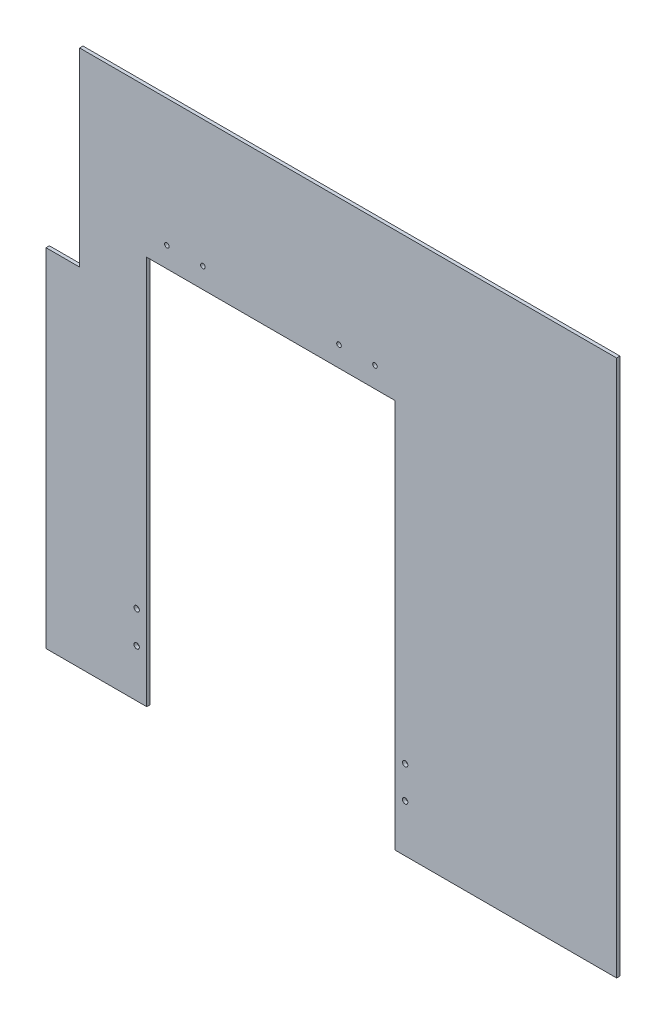
ISO-10303-21;
HEADER;
FILE_DESCRIPTION(('STEP AP214'),'2;1');
FILE_NAME('part.step','',(''),(''),'','','');
FILE_SCHEMA(('AUTOMOTIVE_DESIGN { 1 0 10303 214 1 1 1 1 }'));
ENDSEC;
DATA;
#1=APPLICATION_CONTEXT('core data for automotive mechanical design processes');
#2=APPLICATION_PROTOCOL_DEFINITION('international standard','automotive_design',2000,#1);
#3=PRODUCT_CONTEXT('',#1,'mechanical');
#4=PRODUCT('Part','Part','',(#3));
#5=PRODUCT_RELATED_PRODUCT_CATEGORY('part','',(#4));
#6=PRODUCT_DEFINITION_FORMATION('','',#4);
#7=PRODUCT_DEFINITION_CONTEXT('part definition',#1,'design');
#8=PRODUCT_DEFINITION('design','',#6,#7);
#9=PRODUCT_DEFINITION_SHAPE('','',#8);
#10=(LENGTH_UNIT() NAMED_UNIT(*) SI_UNIT(.MILLI.,.METRE.));
#11=(NAMED_UNIT(*) PLANE_ANGLE_UNIT() SI_UNIT($,.RADIAN.));
#12=(NAMED_UNIT(*) SI_UNIT($,.STERADIAN.) SOLID_ANGLE_UNIT());
#13=UNCERTAINTY_MEASURE_WITH_UNIT(LENGTH_MEASURE(1.E-05),#10,'distance_accuracy_value','');
#14=(GEOMETRIC_REPRESENTATION_CONTEXT(3) GLOBAL_UNCERTAINTY_ASSIGNED_CONTEXT((#13)) GLOBAL_UNIT_ASSIGNED_CONTEXT((#10,
#11,#12)) REPRESENTATION_CONTEXT('',''));
#15=CARTESIAN_POINT('',(0.,0.,0.));
#16=DIRECTION('',(0.,0.,1.));
#17=DIRECTION('',(1.,0.,0.));
#18=AXIS2_PLACEMENT_3D('',#15,#16,#17);
#19=CARTESIAN_POINT('',(0.,0.,3.175));
#20=DIRECTION('',(0.,1.,0.));
#21=DIRECTION('',(0.,0.,1.));
#22=AXIS2_PLACEMENT_3D('',#19,#20,#21);
#23=PLANE('',#22);
#24=DIRECTION('',(1.,0.,0.));
#25=VECTOR('',#24,1.);
#26=CARTESIAN_POINT('',(0.,0.,0.));
#27=LINE('',#26,#25);
#28=CARTESIAN_POINT('',(0.,0.,0.));
#29=VERTEX_POINT('',#28);
#30=CARTESIAN_POINT('',(95.2500000000001,-1.02649894704531E-13,0.));
#31=VERTEX_POINT('',#30);
#32=EDGE_CURVE('E144',#29,#31,#27,.T.);
#33=ORIENTED_EDGE('',*,*,#32,.T.);
#34=DIRECTION('',(0.,0.,-1.));
#35=VECTOR('',#34,1.);
#36=CARTESIAN_POINT('',(95.2500000000001,-1.02649894704531E-13,44.45));
#37=LINE('',#36,#35);
#38=CARTESIAN_POINT('',(95.2500000000001,-1.02649894704531E-13,3.175));
#39=VERTEX_POINT('',#38);
#40=EDGE_CURVE('E241',#39,#31,#37,.T.);
#41=ORIENTED_EDGE('',*,*,#40,.F.);
#42=DIRECTION('',(1.,0.,0.));
#43=VECTOR('',#42,1.);
#44=CARTESIAN_POINT('',(0.,0.,3.175));
#45=LINE('',#44,#43);
#46=CARTESIAN_POINT('',(0.,0.,3.175));
#47=VERTEX_POINT('',#46);
#48=EDGE_CURVE('E194',#47,#39,#45,.T.);
#49=ORIENTED_EDGE('',*,*,#48,.F.);
#50=DIRECTION('',(0.,0.,-1.));
#51=VECTOR('',#50,1.);
#52=CARTESIAN_POINT('',(0.,0.,3.175));
#53=LINE('',#52,#51);
#54=EDGE_CURVE('E11',#47,#29,#53,.T.);
#55=ORIENTED_EDGE('',*,*,#54,.T.);
#56=EDGE_LOOP('',(#33,#41,#49,#55));
#57=FACE_BOUND('',#56,.T.);
#58=ADVANCED_FACE('F43',(#57),#23,.F.);
#59=CARTESIAN_POINT('',(0.,0.,3.175));
#60=DIRECTION('',(1.,0.,0.));
#61=DIRECTION('',(0.,0.,-1.));
#62=AXIS2_PLACEMENT_3D('',#59,#60,#61);
#63=PLANE('',#62);
#64=DIRECTION('',(0.,-1.,0.));
#65=VECTOR('',#64,1.);
#66=CARTESIAN_POINT('',(0.,0.,3.175));
#67=LINE('',#66,#65);
#68=CARTESIAN_POINT('',(0.,328.45375,3.175));
#69=VERTEX_POINT('',#68);
#70=EDGE_CURVE('E138',#69,#47,#67,.T.);
#71=ORIENTED_EDGE('',*,*,#70,.F.);
#72=DIRECTION('',(0.,0.,1.));
#73=VECTOR('',#72,1.);
#74=CARTESIAN_POINT('',(0.,328.45375,0.));
#75=LINE('',#74,#73);
#76=CARTESIAN_POINT('',(0.,328.45375,0.));
#77=VERTEX_POINT('',#76);
#78=EDGE_CURVE('E125',#77,#69,#75,.T.);
#79=ORIENTED_EDGE('',*,*,#78,.F.);
#80=DIRECTION('',(0.,-1.,0.));
#81=VECTOR('',#80,1.);
#82=CARTESIAN_POINT('',(0.,0.,0.));
#83=LINE('',#82,#81);
#84=EDGE_CURVE('E136',#77,#29,#83,.T.);
#85=ORIENTED_EDGE('',*,*,#84,.T.);
#86=ORIENTED_EDGE('',*,*,#54,.F.);
#87=EDGE_LOOP('',(#71,#79,#85,#86));
#88=FACE_BOUND('',#87,.T.);
#89=ADVANCED_FACE('F45',(#88),#63,.F.);
#90=CARTESIAN_POINT('',(330.2,0.,3.175));
#91=VERTEX_POINT('',#90);
#92=CARTESIAN_POINT('',(539.75,0.,3.175));
#93=VERTEX_POINT('',#92);
#94=EDGE_CURVE('E197',#91,#93,#45,.T.);
#95=ORIENTED_EDGE('',*,*,#94,.F.);
#96=DIRECTION('',(0.,0.,-1.));
#97=VECTOR('',#96,1.);
#98=CARTESIAN_POINT('',(330.2,0.,44.45));
#99=LINE('',#98,#97);
#100=CARTESIAN_POINT('',(330.2,0.,0.));
#101=VERTEX_POINT('',#100);
#102=EDGE_CURVE('E237',#91,#101,#99,.T.);
#103=ORIENTED_EDGE('',*,*,#102,.T.);
#104=CARTESIAN_POINT('',(539.75,0.,0.));
#105=VERTEX_POINT('',#104);
#106=EDGE_CURVE('E146',#101,#105,#27,.T.);
#107=ORIENTED_EDGE('',*,*,#106,.T.);
#108=DIRECTION('',(0.,0.,-1.));
#109=VECTOR('',#108,1.);
#110=CARTESIAN_POINT('',(539.75,0.,3.175));
#111=LINE('',#110,#109);
#112=EDGE_CURVE('E52',#93,#105,#111,.T.);
#113=ORIENTED_EDGE('',*,*,#112,.F.);
#114=EDGE_LOOP('',(#95,#103,#107,#113));
#115=FACE_BOUND('',#114,.T.);
#116=ADVANCED_FACE('F321',(#115),#23,.F.);
#117=CARTESIAN_POINT('',(539.75,0.,3.175));
#118=DIRECTION('',(-1.,0.,0.));
#119=DIRECTION('',(0.,0.,1.));
#120=AXIS2_PLACEMENT_3D('',#117,#118,#119);
#121=PLANE('',#120);
#122=DIRECTION('',(0.,1.,0.));
#123=VECTOR('',#122,1.);
#124=CARTESIAN_POINT('',(539.75,0.,0.));
#125=LINE('',#124,#123);
#126=CARTESIAN_POINT('',(539.75,508.,0.));
#127=VERTEX_POINT('',#126);
#128=EDGE_CURVE('E160',#105,#127,#125,.T.);
#129=ORIENTED_EDGE('',*,*,#128,.T.);
#130=DIRECTION('',(0.,0.,-1.));
#131=VECTOR('',#130,1.);
#132=CARTESIAN_POINT('',(539.75,508.,3.175));
#133=LINE('',#132,#131);
#134=CARTESIAN_POINT('',(539.75,508.,3.175));
#135=VERTEX_POINT('',#134);
#136=EDGE_CURVE('E167',#135,#127,#133,.T.);
#137=ORIENTED_EDGE('',*,*,#136,.F.);
#138=DIRECTION('',(0.,1.,0.));
#139=VECTOR('',#138,1.);
#140=CARTESIAN_POINT('',(539.75,0.,3.175));
#141=LINE('',#140,#139);
#142=EDGE_CURVE('E178',#93,#135,#141,.T.);
#143=ORIENTED_EDGE('',*,*,#142,.F.);
#144=ORIENTED_EDGE('',*,*,#112,.T.);
#145=EDGE_LOOP('',(#129,#137,#143,#144));
#146=FACE_BOUND('',#145,.T.);
#147=ADVANCED_FACE('F176',(#146),#121,.F.);
#148=CARTESIAN_POINT('',(0.,508.,3.175));
#149=DIRECTION('',(0.,-1.,0.));
#150=DIRECTION('',(0.,0.,-1.));
#151=AXIS2_PLACEMENT_3D('',#148,#149,#150);
#152=PLANE('',#151);
#153=DIRECTION('',(-1.,0.,0.));
#154=VECTOR('',#153,1.);
#155=CARTESIAN_POINT('',(0.,508.,0.));
#156=LINE('',#155,#154);
#157=CARTESIAN_POINT('',(31.75,508.,0.));
#158=VERTEX_POINT('',#157);
#159=EDGE_CURVE('E163',#127,#158,#156,.T.);
#160=ORIENTED_EDGE('',*,*,#159,.T.);
#161=DIRECTION('',(0.,0.,1.));
#162=VECTOR('',#161,1.);
#163=CARTESIAN_POINT('',(31.75,508.,0.));
#164=LINE('',#163,#162);
#165=CARTESIAN_POINT('',(31.75,508.,3.175));
#166=VERTEX_POINT('',#165);
#167=EDGE_CURVE('E188',#158,#166,#164,.T.);
#168=ORIENTED_EDGE('',*,*,#167,.T.);
#169=DIRECTION('',(-1.,0.,0.));
#170=VECTOR('',#169,1.);
#171=CARTESIAN_POINT('',(0.,508.,3.175));
#172=LINE('',#171,#170);
#173=EDGE_CURVE('E156',#135,#166,#172,.T.);
#174=ORIENTED_EDGE('',*,*,#173,.F.);
#175=ORIENTED_EDGE('',*,*,#136,.T.);
#176=EDGE_LOOP('',(#160,#168,#174,#175));
#177=FACE_BOUND('',#176,.T.);
#178=ADVANCED_FACE('F186',(#177),#152,.F.);
#179=CARTESIAN_POINT('',(0.,0.,3.175));
#180=DIRECTION('',(0.,0.,-1.));
#181=DIRECTION('',(-1.,0.,0.));
#182=AXIS2_PLACEMENT_3D('',#179,#180,#181);
#183=PLANE('',#182);
#184=CARTESIAN_POINT('',(311.1754,387.604,3.175));
#185=DIRECTION('',(0.,0.,-1.));
#186=DIRECTION('',(-1.,0.,0.));
#187=AXIS2_PLACEMENT_3D('',#184,#185,#186);
#188=CIRCLE('',#187,2.15900000000003);
#189=CARTESIAN_POINT('',(309.0164,387.604,3.175));
#190=VERTEX_POINT('',#189);
#191=EDGE_CURVE('E263',#190,#190,#188,.T.);
#192=ORIENTED_EDGE('',*,*,#191,.T.);
#193=EDGE_LOOP('',(#192));
#194=FACE_BOUND('',#193,.T.);
#195=CARTESIAN_POINT('',(277.1394,387.604,3.175));
#196=DIRECTION('',(0.,0.,-1.));
#197=DIRECTION('',(-1.,0.,0.));
#198=AXIS2_PLACEMENT_3D('',#195,#196,#197);
#199=CIRCLE('',#198,2.15900000000003);
#200=CARTESIAN_POINT('',(274.9804,387.604,3.175));
#201=VERTEX_POINT('',#200);
#202=EDGE_CURVE('E280',#201,#201,#199,.T.);
#203=ORIENTED_EDGE('',*,*,#202,.T.);
#204=EDGE_LOOP('',(#203));
#205=FACE_BOUND('',#204,.T.);
#206=CARTESIAN_POINT('',(148.3614,387.604,3.175));
#207=DIRECTION('',(0.,0.,-1.));
#208=DIRECTION('',(-1.,0.,0.));
#209=AXIS2_PLACEMENT_3D('',#206,#207,#208);
#210=CIRCLE('',#209,2.159);
#211=CARTESIAN_POINT('',(146.2024,387.604,3.175));
#212=VERTEX_POINT('',#211);
#213=EDGE_CURVE('E272',#212,#212,#210,.T.);
#214=ORIENTED_EDGE('',*,*,#213,.T.);
#215=EDGE_LOOP('',(#214));
#216=FACE_BOUND('',#215,.T.);
#217=CARTESIAN_POINT('',(114.3254,387.604,3.175));
#218=DIRECTION('',(0.,0.,-1.));
#219=DIRECTION('',(-1.,0.,0.));
#220=AXIS2_PLACEMENT_3D('',#217,#218,#219);
#221=CIRCLE('',#220,2.159);
#222=CARTESIAN_POINT('',(112.1664,387.604,3.175));
#223=VERTEX_POINT('',#222);
#224=EDGE_CURVE('E264',#223,#223,#221,.T.);
#225=ORIENTED_EDGE('',*,*,#224,.T.);
#226=EDGE_LOOP('',(#225));
#227=FACE_BOUND('',#226,.T.);
#228=CARTESIAN_POINT('',(85.7250000000001,45.085,3.175));
#229=DIRECTION('',(0.,0.,-1.));
#230=DIRECTION('',(-1.,0.,0.));
#231=AXIS2_PLACEMENT_3D('',#228,#229,#230);
#232=CIRCLE('',#231,2.53999999999998);
#233=CARTESIAN_POINT('',(83.1850000000001,45.085,3.175));
#234=VERTEX_POINT('',#233);
#235=EDGE_CURVE('E147',#234,#234,#232,.T.);
#236=ORIENTED_EDGE('',*,*,#235,.T.);
#237=EDGE_LOOP('',(#236));
#238=FACE_BOUND('',#237,.T.);
#239=CARTESIAN_POINT('',(339.725,75.565,3.175));
#240=DIRECTION('',(0.,0.,-1.));
#241=DIRECTION('',(-1.,0.,0.));
#242=AXIS2_PLACEMENT_3D('',#239,#240,#241);
#243=CIRCLE('',#242,2.54000000000001);
#244=CARTESIAN_POINT('',(337.185,75.565,3.175));
#245=VERTEX_POINT('',#244);
#246=EDGE_CURVE('E153',#245,#245,#243,.T.);
#247=ORIENTED_EDGE('',*,*,#246,.T.);
#248=EDGE_LOOP('',(#247));
#249=FACE_BOUND('',#248,.T.);
#250=ORIENTED_EDGE('',*,*,#173,.T.);
#251=DIRECTION('',(0.,1.,0.));
#252=VECTOR('',#251,1.);
#253=CARTESIAN_POINT('',(31.75,403.06625,3.175));
#254=LINE('',#253,#252);
#255=CARTESIAN_POINT('',(31.75,328.45375,3.175));
#256=VERTEX_POINT('',#255);
#257=EDGE_CURVE('E131',#256,#166,#254,.T.);
#258=ORIENTED_EDGE('',*,*,#257,.F.);
#259=DIRECTION('',(1.,0.,0.));
#260=VECTOR('',#259,1.);
#261=CARTESIAN_POINT('',(0.,328.45375,3.175));
#262=LINE('',#261,#260);
#263=EDGE_CURVE('E301',#69,#256,#262,.T.);
#264=ORIENTED_EDGE('',*,*,#263,.F.);
#265=ORIENTED_EDGE('',*,*,#70,.T.);
#266=ORIENTED_EDGE('',*,*,#48,.T.);
#267=DIRECTION('',(0.,1.,0.));
#268=VECTOR('',#267,1.);
#269=CARTESIAN_POINT('',(95.2500000000001,0.,3.175));
#270=LINE('',#269,#268);
#271=CARTESIAN_POINT('',(95.2500000000001,368.3,3.175));
#272=VERTEX_POINT('',#271);
#273=EDGE_CURVE('E205',#39,#272,#270,.T.);
#274=ORIENTED_EDGE('',*,*,#273,.T.);
#275=DIRECTION('',(1.,0.,0.));
#276=VECTOR('',#275,1.);
#277=CARTESIAN_POINT('',(0.,368.3,3.175));
#278=LINE('',#277,#276);
#279=CARTESIAN_POINT('',(330.2,368.3,3.175));
#280=VERTEX_POINT('',#279);
#281=EDGE_CURVE('E213',#272,#280,#278,.T.);
#282=ORIENTED_EDGE('',*,*,#281,.T.);
#283=DIRECTION('',(0.,-1.,0.));
#284=VECTOR('',#283,1.);
#285=CARTESIAN_POINT('',(330.2,0.,3.175));
#286=LINE('',#285,#284);
#287=EDGE_CURVE('E209',#280,#91,#286,.T.);
#288=ORIENTED_EDGE('',*,*,#287,.T.);
#289=ORIENTED_EDGE('',*,*,#94,.T.);
#290=ORIENTED_EDGE('',*,*,#142,.T.);
#291=EDGE_LOOP('',(#250,#258,#264,#265,#266,#274,#282,#288,#289,#290));
#292=FACE_BOUND('',#291,.T.);
#293=CARTESIAN_POINT('',(85.725,75.565,3.175));
#294=DIRECTION('',(0.,0.,-1.));
#295=DIRECTION('',(-1.,0.,0.));
#296=AXIS2_PLACEMENT_3D('',#293,#294,#295);
#297=CIRCLE('',#296,2.54000000000001);
#298=CARTESIAN_POINT('',(83.185,75.565,3.175));
#299=VERTEX_POINT('',#298);
#300=EDGE_CURVE('E217',#299,#299,#297,.T.);
#301=ORIENTED_EDGE('',*,*,#300,.T.);
#302=EDGE_LOOP('',(#301));
#303=FACE_BOUND('',#302,.T.);
#304=CARTESIAN_POINT('',(339.725,45.085,3.175));
#305=DIRECTION('',(0.,0.,-1.));
#306=DIRECTION('',(-1.,0.,0.));
#307=AXIS2_PLACEMENT_3D('',#304,#305,#306);
#308=CIRCLE('',#307,2.54000000000001);
#309=CARTESIAN_POINT('',(337.185,45.085,3.175));
#310=VERTEX_POINT('',#309);
#311=EDGE_CURVE('E221',#310,#310,#308,.T.);
#312=ORIENTED_EDGE('',*,*,#311,.T.);
#313=EDGE_LOOP('',(#312));
#314=FACE_BOUND('',#313,.T.);
#315=ADVANCED_FACE('F305',(#194,#205,#216,#227,#238,#249,#292,#303,#314),#183,.F.);
#316=CARTESIAN_POINT('',(0.,0.,0.));
#317=DIRECTION('',(0.,0.,-1.));
#318=DIRECTION('',(-1.,0.,0.));
#319=AXIS2_PLACEMENT_3D('',#316,#317,#318);
#320=PLANE('',#319);
#321=DIRECTION('',(0.,1.,0.));
#322=VECTOR('',#321,1.);
#323=CARTESIAN_POINT('',(31.75,403.06625,0.));
#324=LINE('',#323,#322);
#325=CARTESIAN_POINT('',(31.75,328.45375,0.));
#326=VERTEX_POINT('',#325);
#327=EDGE_CURVE('E59',#326,#158,#324,.T.);
#328=ORIENTED_EDGE('',*,*,#327,.T.);
#329=ORIENTED_EDGE('',*,*,#159,.F.);
#330=ORIENTED_EDGE('',*,*,#128,.F.);
#331=ORIENTED_EDGE('',*,*,#106,.F.);
#332=DIRECTION('',(0.,-1.,0.));
#333=VECTOR('',#332,1.);
#334=CARTESIAN_POINT('',(330.2,0.,0.));
#335=LINE('',#334,#333);
#336=CARTESIAN_POINT('',(330.2,368.3,0.));
#337=VERTEX_POINT('',#336);
#338=EDGE_CURVE('E234',#337,#101,#335,.T.);
#339=ORIENTED_EDGE('',*,*,#338,.F.);
#340=DIRECTION('',(1.,0.,0.));
#341=VECTOR('',#340,1.);
#342=CARTESIAN_POINT('',(95.2500000000001,368.3,0.));
#343=LINE('',#342,#341);
#344=CARTESIAN_POINT('',(95.2500000000001,368.3,0.));
#345=VERTEX_POINT('',#344);
#346=EDGE_CURVE('E247',#345,#337,#343,.T.);
#347=ORIENTED_EDGE('',*,*,#346,.F.);
#348=DIRECTION('',(0.,1.,0.));
#349=VECTOR('',#348,1.);
#350=CARTESIAN_POINT('',(95.2500000000001,-1.02649894704531E-13,0.));
#351=LINE('',#350,#349);
#352=EDGE_CURVE('E67',#31,#345,#351,.T.);
#353=ORIENTED_EDGE('',*,*,#352,.F.);
#354=ORIENTED_EDGE('',*,*,#32,.F.);
#355=ORIENTED_EDGE('',*,*,#84,.F.);
#356=DIRECTION('',(1.,0.,0.));
#357=VECTOR('',#356,1.);
#358=CARTESIAN_POINT('',(0.,328.45375,0.));
#359=LINE('',#358,#357);
#360=EDGE_CURVE('E121',#77,#326,#359,.T.);
#361=ORIENTED_EDGE('',*,*,#360,.T.);
#362=EDGE_LOOP('',(#328,#329,#330,#331,#339,#347,#353,#354,#355,#361));
#363=FACE_BOUND('',#362,.T.);
#364=CARTESIAN_POINT('',(311.1754,387.604,0.));
#365=DIRECTION('',(0.,0.,-1.));
#366=DIRECTION('',(-1.,0.,0.));
#367=AXIS2_PLACEMENT_3D('',#364,#365,#366);
#368=CIRCLE('',#367,2.15900000000003);
#369=CARTESIAN_POINT('',(309.0164,387.604,0.));
#370=VERTEX_POINT('',#369);
#371=EDGE_CURVE('E288',#370,#370,#368,.T.);
#372=ORIENTED_EDGE('',*,*,#371,.F.);
#373=EDGE_LOOP('',(#372));
#374=FACE_BOUND('',#373,.T.);
#375=CARTESIAN_POINT('',(277.1394,387.604,0.));
#376=DIRECTION('',(0.,0.,-1.));
#377=DIRECTION('',(-1.,0.,0.));
#378=AXIS2_PLACEMENT_3D('',#375,#376,#377);
#379=CIRCLE('',#378,2.15900000000003);
#380=CARTESIAN_POINT('',(274.9804,387.604,0.));
#381=VERTEX_POINT('',#380);
#382=EDGE_CURVE('E284',#381,#381,#379,.T.);
#383=ORIENTED_EDGE('',*,*,#382,.F.);
#384=EDGE_LOOP('',(#383));
#385=FACE_BOUND('',#384,.T.);
#386=CARTESIAN_POINT('',(148.3614,387.604,0.));
#387=DIRECTION('',(0.,0.,-1.));
#388=DIRECTION('',(-1.,0.,0.));
#389=AXIS2_PLACEMENT_3D('',#386,#387,#388);
#390=CIRCLE('',#389,2.159);
#391=CARTESIAN_POINT('',(146.2024,387.604,0.));
#392=VERTEX_POINT('',#391);
#393=EDGE_CURVE('E276',#392,#392,#390,.T.);
#394=ORIENTED_EDGE('',*,*,#393,.F.);
#395=EDGE_LOOP('',(#394));
#396=FACE_BOUND('',#395,.T.);
#397=CARTESIAN_POINT('',(114.3254,387.604,0.));
#398=DIRECTION('',(0.,0.,-1.));
#399=DIRECTION('',(-1.,0.,0.));
#400=AXIS2_PLACEMENT_3D('',#397,#398,#399);
#401=CIRCLE('',#400,2.159);
#402=CARTESIAN_POINT('',(112.1664,387.604,0.));
#403=VERTEX_POINT('',#402);
#404=EDGE_CURVE('E268',#403,#403,#401,.T.);
#405=ORIENTED_EDGE('',*,*,#404,.F.);
#406=EDGE_LOOP('',(#405));
#407=FACE_BOUND('',#406,.T.);
#408=CARTESIAN_POINT('',(85.7250000000001,45.085,0.));
#409=DIRECTION('',(0.,0.,-1.));
#410=DIRECTION('',(-1.,0.,0.));
#411=AXIS2_PLACEMENT_3D('',#408,#409,#410);
#412=CIRCLE('',#411,2.53999999999998);
#413=CARTESIAN_POINT('',(83.1850000000001,45.085,0.));
#414=VERTEX_POINT('',#413);
#415=EDGE_CURVE('E229',#414,#414,#412,.T.);
#416=ORIENTED_EDGE('',*,*,#415,.F.);
#417=EDGE_LOOP('',(#416));
#418=FACE_BOUND('',#417,.T.);
#419=CARTESIAN_POINT('',(339.725,75.565,0.));
#420=DIRECTION('',(0.,0.,-1.));
#421=DIRECTION('',(-1.,0.,0.));
#422=AXIS2_PLACEMENT_3D('',#419,#420,#421);
#423=CIRCLE('',#422,2.54000000000001);
#424=CARTESIAN_POINT('',(337.185,75.565,0.));
#425=VERTEX_POINT('',#424);
#426=EDGE_CURVE('E244',#425,#425,#423,.T.);
#427=ORIENTED_EDGE('',*,*,#426,.F.);
#428=EDGE_LOOP('',(#427));
#429=FACE_BOUND('',#428,.T.);
#430=CARTESIAN_POINT('',(85.725,75.565,0.));
#431=DIRECTION('',(0.,0.,-1.));
#432=DIRECTION('',(1.,0.,0.));
#433=AXIS2_PLACEMENT_3D('',#430,#431,#432);
#434=CIRCLE('',#433,2.54000000000001);
#435=CARTESIAN_POINT('',(88.265,75.565,0.));
#436=VERTEX_POINT('',#435);
#437=EDGE_CURVE('E253',#436,#436,#434,.T.);
#438=ORIENTED_EDGE('',*,*,#437,.F.);
#439=EDGE_LOOP('',(#438));
#440=FACE_BOUND('',#439,.T.);
#441=CARTESIAN_POINT('',(339.725,45.085,0.));
#442=DIRECTION('',(0.,0.,-1.));
#443=DIRECTION('',(-1.,0.,0.));
#444=AXIS2_PLACEMENT_3D('',#441,#442,#443);
#445=CIRCLE('',#444,2.54000000000001);
#446=CARTESIAN_POINT('',(337.185,45.085,0.));
#447=VERTEX_POINT('',#446);
#448=EDGE_CURVE('E225',#447,#447,#445,.T.);
#449=ORIENTED_EDGE('',*,*,#448,.F.);
#450=EDGE_LOOP('',(#449));
#451=FACE_BOUND('',#450,.T.);
#452=ADVANCED_FACE('F141',(#363,#374,#385,#396,#407,#418,#429,#440,#451),#320,.T.);
#453=CARTESIAN_POINT('',(339.725,45.085,44.45));
#454=DIRECTION('',(0.,0.,-1.));
#455=DIRECTION('',(-1.,0.,0.));
#456=AXIS2_PLACEMENT_3D('',#453,#454,#455);
#457=CYLINDRICAL_SURFACE('',#456,2.54000000000001);
#458=ORIENTED_EDGE('',*,*,#448,.T.);
#459=EDGE_LOOP('',(#458));
#460=FACE_BOUND('',#459,.T.);
#461=ORIENTED_EDGE('',*,*,#311,.F.);
#462=EDGE_LOOP('',(#461));
#463=FACE_BOUND('',#462,.T.);
#464=ADVANCED_FACE('F348',(#460,#463),#457,.F.);
#465=CARTESIAN_POINT('',(85.725,75.565,44.45));
#466=DIRECTION('',(0.,0.,-1.));
#467=DIRECTION('',(-1.,0.,0.));
#468=AXIS2_PLACEMENT_3D('',#465,#466,#467);
#469=CYLINDRICAL_SURFACE('',#468,2.54000000000001);
#470=ORIENTED_EDGE('',*,*,#437,.T.);
#471=EDGE_LOOP('',(#470));
#472=FACE_BOUND('',#471,.T.);
#473=ORIENTED_EDGE('',*,*,#300,.F.);
#474=EDGE_LOOP('',(#473));
#475=FACE_BOUND('',#474,.T.);
#476=ADVANCED_FACE('F341',(#472,#475),#469,.F.);
#477=CARTESIAN_POINT('',(95.2500000000001,-1.02649894704531E-13,44.45));
#478=DIRECTION('',(-1.,0.,0.));
#479=DIRECTION('',(0.,0.,1.));
#480=AXIS2_PLACEMENT_3D('',#477,#478,#479);
#481=PLANE('',#480);
#482=ORIENTED_EDGE('',*,*,#40,.T.);
#483=ORIENTED_EDGE('',*,*,#352,.T.);
#484=DIRECTION('',(0.,0.,-1.));
#485=VECTOR('',#484,1.);
#486=CARTESIAN_POINT('',(95.2500000000001,368.3,44.45));
#487=LINE('',#486,#485);
#488=EDGE_CURVE('E230',#272,#345,#487,.T.);
#489=ORIENTED_EDGE('',*,*,#488,.F.);
#490=ORIENTED_EDGE('',*,*,#273,.F.);
#491=EDGE_LOOP('',(#482,#483,#489,#490));
#492=FACE_BOUND('',#491,.T.);
#493=ADVANCED_FACE('F339',(#492),#481,.F.);
#494=CARTESIAN_POINT('',(330.2,0.,44.45));
#495=DIRECTION('',(1.,0.,0.));
#496=DIRECTION('',(0.,0.,-1.));
#497=AXIS2_PLACEMENT_3D('',#494,#495,#496);
#498=PLANE('',#497);
#499=DIRECTION('',(0.,0.,-1.));
#500=VECTOR('',#499,1.);
#501=CARTESIAN_POINT('',(330.2,368.3,44.45));
#502=LINE('',#501,#500);
#503=EDGE_CURVE('E233',#280,#337,#502,.T.);
#504=ORIENTED_EDGE('',*,*,#503,.T.);
#505=ORIENTED_EDGE('',*,*,#338,.T.);
#506=ORIENTED_EDGE('',*,*,#102,.F.);
#507=ORIENTED_EDGE('',*,*,#287,.F.);
#508=EDGE_LOOP('',(#504,#505,#506,#507));
#509=FACE_BOUND('',#508,.T.);
#510=ADVANCED_FACE('F333',(#509),#498,.F.);
#511=CARTESIAN_POINT('',(95.2500000000001,368.3,44.45));
#512=DIRECTION('',(0.,1.,0.));
#513=DIRECTION('',(0.,0.,1.));
#514=AXIS2_PLACEMENT_3D('',#511,#512,#513);
#515=PLANE('',#514);
#516=ORIENTED_EDGE('',*,*,#488,.T.);
#517=ORIENTED_EDGE('',*,*,#346,.T.);
#518=ORIENTED_EDGE('',*,*,#503,.F.);
#519=ORIENTED_EDGE('',*,*,#281,.F.);
#520=EDGE_LOOP('',(#516,#517,#518,#519));
#521=FACE_BOUND('',#520,.T.);
#522=ADVANCED_FACE('F335',(#521),#515,.F.);
#523=CARTESIAN_POINT('',(339.725,75.565,44.45));
#524=DIRECTION('',(0.,0.,-1.));
#525=DIRECTION('',(-1.,0.,0.));
#526=AXIS2_PLACEMENT_3D('',#523,#524,#525);
#527=CYLINDRICAL_SURFACE('',#526,2.54000000000001);
#528=ORIENTED_EDGE('',*,*,#426,.T.);
#529=EDGE_LOOP('',(#528));
#530=FACE_BOUND('',#529,.T.);
#531=ORIENTED_EDGE('',*,*,#246,.F.);
#532=EDGE_LOOP('',(#531));
#533=FACE_BOUND('',#532,.T.);
#534=ADVANCED_FACE('F405',(#530,#533),#527,.F.);
#535=CARTESIAN_POINT('',(85.7250000000001,45.085,44.45));
#536=DIRECTION('',(0.,0.,-1.));
#537=DIRECTION('',(-1.,0.,0.));
#538=AXIS2_PLACEMENT_3D('',#535,#536,#537);
#539=CYLINDRICAL_SURFACE('',#538,2.53999999999998);
#540=ORIENTED_EDGE('',*,*,#415,.T.);
#541=EDGE_LOOP('',(#540));
#542=FACE_BOUND('',#541,.T.);
#543=ORIENTED_EDGE('',*,*,#235,.F.);
#544=EDGE_LOOP('',(#543));
#545=FACE_BOUND('',#544,.T.);
#546=ADVANCED_FACE('F414',(#542,#545),#539,.F.);
#547=CARTESIAN_POINT('',(114.3254,387.604,3.175));
#548=DIRECTION('',(0.,0.,-1.));
#549=DIRECTION('',(-1.,0.,0.));
#550=AXIS2_PLACEMENT_3D('',#547,#548,#549);
#551=CYLINDRICAL_SURFACE('',#550,2.159);
#552=ORIENTED_EDGE('',*,*,#224,.F.);
#553=EDGE_LOOP('',(#552));
#554=FACE_BOUND('',#553,.T.);
#555=ORIENTED_EDGE('',*,*,#404,.T.);
#556=EDGE_LOOP('',(#555));
#557=FACE_BOUND('',#556,.T.);
#558=ADVANCED_FACE('F425',(#554,#557),#551,.F.);
#559=CARTESIAN_POINT('',(148.3614,387.604,3.175));
#560=DIRECTION('',(0.,0.,-1.));
#561=DIRECTION('',(-1.,0.,0.));
#562=AXIS2_PLACEMENT_3D('',#559,#560,#561);
#563=CYLINDRICAL_SURFACE('',#562,2.159);
#564=ORIENTED_EDGE('',*,*,#213,.F.);
#565=EDGE_LOOP('',(#564));
#566=FACE_BOUND('',#565,.T.);
#567=ORIENTED_EDGE('',*,*,#393,.T.);
#568=EDGE_LOOP('',(#567));
#569=FACE_BOUND('',#568,.T.);
#570=ADVANCED_FACE('F436',(#566,#569),#563,.F.);
#571=CARTESIAN_POINT('',(277.1394,387.604,3.175));
#572=DIRECTION('',(0.,0.,-1.));
#573=DIRECTION('',(-1.,0.,0.));
#574=AXIS2_PLACEMENT_3D('',#571,#572,#573);
#575=CYLINDRICAL_SURFACE('',#574,2.15900000000003);
#576=ORIENTED_EDGE('',*,*,#202,.F.);
#577=EDGE_LOOP('',(#576));
#578=FACE_BOUND('',#577,.T.);
#579=ORIENTED_EDGE('',*,*,#382,.T.);
#580=EDGE_LOOP('',(#579));
#581=FACE_BOUND('',#580,.T.);
#582=ADVANCED_FACE('F316',(#578,#581),#575,.F.);
#583=CARTESIAN_POINT('',(311.1754,387.604,3.175));
#584=DIRECTION('',(0.,0.,-1.));
#585=DIRECTION('',(-1.,0.,0.));
#586=AXIS2_PLACEMENT_3D('',#583,#584,#585);
#587=CYLINDRICAL_SURFACE('',#586,2.15900000000003);
#588=ORIENTED_EDGE('',*,*,#191,.F.);
#589=EDGE_LOOP('',(#588));
#590=FACE_BOUND('',#589,.T.);
#591=ORIENTED_EDGE('',*,*,#371,.T.);
#592=EDGE_LOOP('',(#591));
#593=FACE_BOUND('',#592,.T.);
#594=ADVANCED_FACE('F309',(#590,#593),#587,.F.);
#595=CARTESIAN_POINT('',(31.75,403.06625,0.));
#596=DIRECTION('',(1.,0.,0.));
#597=DIRECTION('',(0.,1.,0.));
#598=AXIS2_PLACEMENT_3D('',#595,#596,#597);
#599=PLANE('',#598);
#600=ORIENTED_EDGE('',*,*,#257,.T.);
#601=ORIENTED_EDGE('',*,*,#167,.F.);
#602=ORIENTED_EDGE('',*,*,#327,.F.);
#603=DIRECTION('',(0.,0.,1.));
#604=VECTOR('',#603,1.);
#605=CARTESIAN_POINT('',(31.75,328.45375,0.));
#606=LINE('',#605,#604);
#607=EDGE_CURVE('E127',#326,#256,#606,.T.);
#608=ORIENTED_EDGE('',*,*,#607,.T.);
#609=EDGE_LOOP('',(#600,#601,#602,#608));
#610=FACE_BOUND('',#609,.T.);
#611=ADVANCED_FACE('F307',(#610),#599,.F.);
#612=CARTESIAN_POINT('',(0.,328.45375,0.));
#613=DIRECTION('',(0.,-1.,0.));
#614=DIRECTION('',(0.,0.,-1.));
#615=AXIS2_PLACEMENT_3D('',#612,#613,#614);
#616=PLANE('',#615);
#617=ORIENTED_EDGE('',*,*,#263,.T.);
#618=ORIENTED_EDGE('',*,*,#607,.F.);
#619=ORIENTED_EDGE('',*,*,#360,.F.);
#620=ORIENTED_EDGE('',*,*,#78,.T.);
#621=EDGE_LOOP('',(#617,#618,#619,#620));
#622=FACE_BOUND('',#621,.T.);
#623=ADVANCED_FACE('F124',(#622),#616,.F.);
#624=CLOSED_SHELL('',(#58,#89,#116,#147,#178,#315,#452,#464,#476,#493,#510,#522,#534,#546,#558,
#570,#582,#594,#611,#623));
#625=MANIFOLD_SOLID_BREP('B2',#624);
#626=ADVANCED_BREP_SHAPE_REPRESENTATION('',(#18,#625),#14);
#627=SHAPE_DEFINITION_REPRESENTATION(#9,#626);
ENDSEC;
END-ISO-10303-21;
